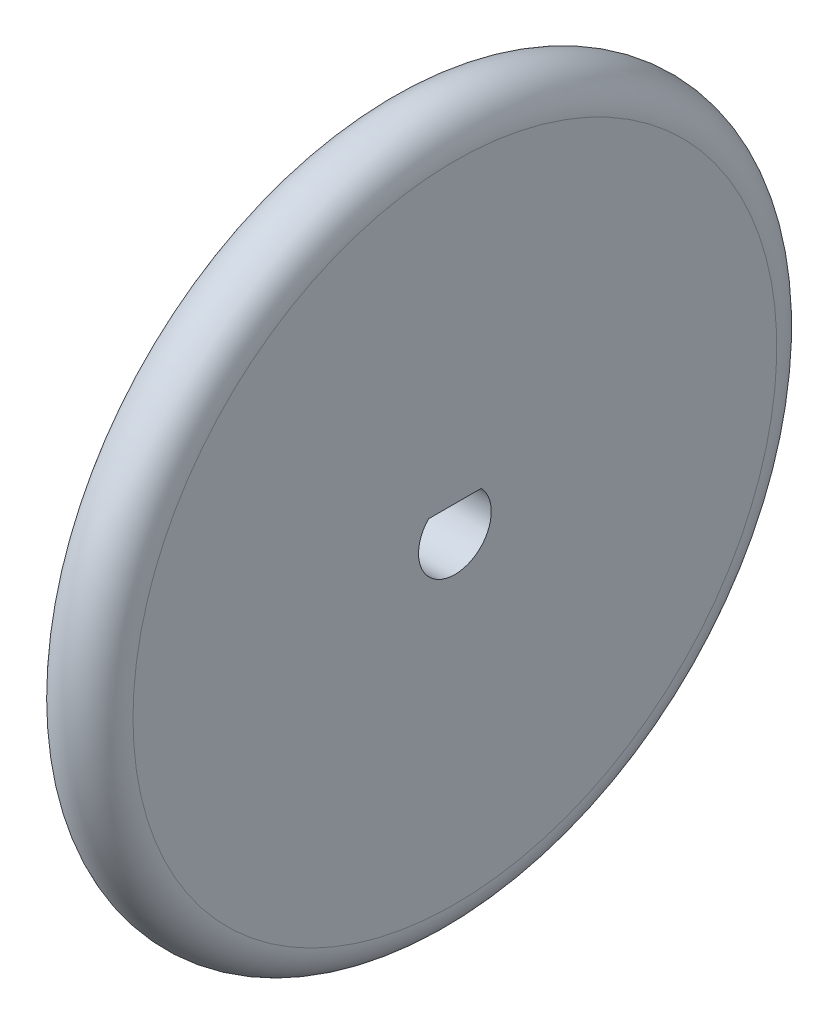
ISO-10303-21;
HEADER;
FILE_DESCRIPTION(('STEP AP214'),'2;1');
FILE_NAME('part.step','',(''),(''),'','','');
FILE_SCHEMA(('AUTOMOTIVE_DESIGN { 1 0 10303 214 1 1 1 1 }'));
ENDSEC;
DATA;
#1=APPLICATION_CONTEXT('core data for automotive mechanical design processes');
#2=APPLICATION_PROTOCOL_DEFINITION('international standard','automotive_design',2000,#1);
#3=PRODUCT_CONTEXT('',#1,'mechanical');
#4=PRODUCT('Part','Part','',(#3));
#5=PRODUCT_RELATED_PRODUCT_CATEGORY('part','',(#4));
#6=PRODUCT_DEFINITION_FORMATION('','',#4);
#7=PRODUCT_DEFINITION_CONTEXT('part definition',#1,'design');
#8=PRODUCT_DEFINITION('design','',#6,#7);
#9=PRODUCT_DEFINITION_SHAPE('','',#8);
#10=(LENGTH_UNIT() NAMED_UNIT(*) SI_UNIT(.MILLI.,.METRE.));
#11=(NAMED_UNIT(*) PLANE_ANGLE_UNIT() SI_UNIT($,.RADIAN.));
#12=(NAMED_UNIT(*) SI_UNIT($,.STERADIAN.) SOLID_ANGLE_UNIT());
#13=UNCERTAINTY_MEASURE_WITH_UNIT(LENGTH_MEASURE(1.E-05),#10,'distance_accuracy_value','');
#14=(GEOMETRIC_REPRESENTATION_CONTEXT(3) GLOBAL_UNCERTAINTY_ASSIGNED_CONTEXT((#13)) GLOBAL_UNIT_ASSIGNED_CONTEXT((#10,
#11,#12)) REPRESENTATION_CONTEXT('',''));
#15=CARTESIAN_POINT('',(0.,0.,0.));
#16=DIRECTION('',(0.,0.,1.));
#17=DIRECTION('',(1.,0.,0.));
#18=AXIS2_PLACEMENT_3D('',#15,#16,#17);
#19=CARTESIAN_POINT('',(0.,0.,0.));
#20=DIRECTION('',(-1.,0.,0.));
#21=DIRECTION('',(0.,0.,1.));
#22=AXIS2_PLACEMENT_3D('',#19,#20,#21);
#23=TOROIDAL_SURFACE('',#22,13.5,1.5);
#24=CARTESIAN_POINT('',(-1.5,0.,0.));
#25=DIRECTION('',(-1.,0.,0.));
#26=DIRECTION('',(0.,0.,1.));
#27=AXIS2_PLACEMENT_3D('',#24,#25,#26);
#28=CIRCLE('',#27,13.5);
#29=CARTESIAN_POINT('',(-1.5,0.,13.5));
#30=VERTEX_POINT('',#29);
#31=EDGE_CURVE('E47',#30,#30,#28,.T.);
#32=ORIENTED_EDGE('',*,*,#31,.F.);
#33=EDGE_LOOP('',(#32));
#34=FACE_BOUND('',#33,.T.);
#35=CARTESIAN_POINT('',(1.5,0.,0.));
#36=DIRECTION('',(-1.,0.,0.));
#37=DIRECTION('',(0.,0.,1.));
#38=AXIS2_PLACEMENT_3D('',#35,#36,#37);
#39=CIRCLE('',#38,13.5);
#40=CARTESIAN_POINT('',(1.5,0.,13.5));
#41=VERTEX_POINT('',#40);
#42=EDGE_CURVE('E93',#41,#41,#39,.T.);
#43=ORIENTED_EDGE('',*,*,#42,.T.);
#44=EDGE_LOOP('',(#43));
#45=FACE_BOUND('',#44,.T.);
#46=ADVANCED_FACE('F39',(#34,#45),#23,.T.);
#47=CARTESIAN_POINT('',(-1.5,13.5,0.));
#48=DIRECTION('',(1.,0.,0.));
#49=DIRECTION('',(0.,0.,-1.));
#50=AXIS2_PLACEMENT_3D('',#47,#48,#49);
#51=PLANE('',#50);
#52=CARTESIAN_POINT('',(-1.5,0.,0.));
#53=DIRECTION('',(1.,0.,0.));
#54=DIRECTION('',(0.,0.,-1.));
#55=AXIS2_PLACEMENT_3D('',#52,#53,#54);
#56=CIRCLE('',#55,4.);
#57=CARTESIAN_POINT('',(-1.5,0.,-4.));
#58=VERTEX_POINT('',#57);
#59=EDGE_CURVE('E11',#58,#58,#56,.F.);
#60=ORIENTED_EDGE('',*,*,#59,.F.);
#61=EDGE_LOOP('',(#60));
#62=FACE_BOUND('',#61,.T.);
#63=ORIENTED_EDGE('',*,*,#31,.T.);
#64=EDGE_LOOP('',(#63));
#65=FACE_BOUND('',#64,.T.);
#66=ADVANCED_FACE('F100',(#62,#65),#51,.F.);
#67=CARTESIAN_POINT('',(1.5,0.,0.));
#68=DIRECTION('',(-1.,0.,0.));
#69=DIRECTION('',(0.,0.,1.));
#70=AXIS2_PLACEMENT_3D('',#67,#68,#69);
#71=PLANE('',#70);
#72=DIRECTION('',(0.,0.,-1.));
#73=VECTOR('',#72,1.);
#74=CARTESIAN_POINT('',(1.5,1.05,-1.10594981802973));
#75=LINE('',#74,#73);
#76=CARTESIAN_POINT('',(1.5,1.05,1.10594981802973));
#77=VERTEX_POINT('',#76);
#78=CARTESIAN_POINT('',(1.5,1.05,-1.10594981802973));
#79=VERTEX_POINT('',#78);
#80=EDGE_CURVE('E85',#77,#79,#75,.T.);
#81=ORIENTED_EDGE('',*,*,#80,.T.);
#82=CARTESIAN_POINT('',(1.5,0.,0.));
#83=DIRECTION('',(-1.,0.,0.));
#84=DIRECTION('',(0.,0.,1.));
#85=AXIS2_PLACEMENT_3D('',#82,#83,#84);
#86=CIRCLE('',#85,1.525);
#87=EDGE_CURVE('E54',#79,#77,#86,.T.);
#88=ORIENTED_EDGE('',*,*,#87,.T.);
#89=EDGE_LOOP('',(#81,#88));
#90=FACE_BOUND('',#89,.T.);
#91=ORIENTED_EDGE('',*,*,#42,.F.);
#92=EDGE_LOOP('',(#91));
#93=FACE_BOUND('',#92,.T.);
#94=ADVANCED_FACE('F106',(#90,#93),#71,.F.);
#95=CARTESIAN_POINT('',(-4.5,0.,0.));
#96=DIRECTION('',(1.,0.,0.));
#97=DIRECTION('',(0.,0.,-1.));
#98=AXIS2_PLACEMENT_3D('',#95,#96,#97);
#99=CYLINDRICAL_SURFACE('',#98,4.);
#100=CARTESIAN_POINT('',(-4.5,0.,0.));
#101=DIRECTION('',(-1.,0.,0.));
#102=DIRECTION('',(0.,0.,1.));
#103=AXIS2_PLACEMENT_3D('',#100,#101,#102);
#104=CIRCLE('',#103,4.);
#105=CARTESIAN_POINT('',(-4.5,0.,4.));
#106=VERTEX_POINT('',#105);
#107=EDGE_CURVE('E71',#106,#106,#104,.T.);
#108=ORIENTED_EDGE('',*,*,#107,.F.);
#109=EDGE_LOOP('',(#108));
#110=FACE_BOUND('',#109,.T.);
#111=ORIENTED_EDGE('',*,*,#59,.T.);
#112=EDGE_LOOP('',(#111));
#113=FACE_BOUND('',#112,.T.);
#114=ADVANCED_FACE('F108',(#110,#113),#99,.T.);
#115=CARTESIAN_POINT('',(-4.5,0.,0.));
#116=DIRECTION('',(-1.,0.,0.));
#117=DIRECTION('',(0.,0.,1.));
#118=AXIS2_PLACEMENT_3D('',#115,#116,#117);
#119=PLANE('',#118);
#120=CARTESIAN_POINT('',(-4.5,0.,0.));
#121=DIRECTION('',(-1.,0.,0.));
#122=DIRECTION('',(0.,0.,1.));
#123=AXIS2_PLACEMENT_3D('',#120,#121,#122);
#124=CIRCLE('',#123,1.525);
#125=CARTESIAN_POINT('',(-4.5,1.05,-1.10594981802973));
#126=VERTEX_POINT('',#125);
#127=CARTESIAN_POINT('',(-4.5,1.05,1.10594981802973));
#128=VERTEX_POINT('',#127);
#129=EDGE_CURVE('E59',#126,#128,#124,.T.);
#130=ORIENTED_EDGE('',*,*,#129,.F.);
#131=DIRECTION('',(0.,0.,-1.));
#132=VECTOR('',#131,1.);
#133=CARTESIAN_POINT('',(-4.5,1.05,-1.10594981802973));
#134=LINE('',#133,#132);
#135=EDGE_CURVE('E75',#128,#126,#134,.T.);
#136=ORIENTED_EDGE('',*,*,#135,.F.);
#137=EDGE_LOOP('',(#130,#136));
#138=FACE_BOUND('',#137,.T.);
#139=ORIENTED_EDGE('',*,*,#107,.T.);
#140=EDGE_LOOP('',(#139));
#141=FACE_BOUND('',#140,.T.);
#142=ADVANCED_FACE('F80',(#138,#141),#119,.T.);
#143=CARTESIAN_POINT('',(1.5,0.,0.));
#144=DIRECTION('',(-1.,0.,0.));
#145=DIRECTION('',(0.,0.,1.));
#146=AXIS2_PLACEMENT_3D('',#143,#144,#145);
#147=CYLINDRICAL_SURFACE('',#146,1.525);
#148=ORIENTED_EDGE('',*,*,#129,.T.);
#149=DIRECTION('',(-1.,0.,0.));
#150=VECTOR('',#149,1.);
#151=CARTESIAN_POINT('',(1.5,1.05,1.10594981802973));
#152=LINE('',#151,#150);
#153=EDGE_CURVE('E72',#77,#128,#152,.T.);
#154=ORIENTED_EDGE('',*,*,#153,.F.);
#155=ORIENTED_EDGE('',*,*,#87,.F.);
#156=DIRECTION('',(-1.,0.,0.));
#157=VECTOR('',#156,1.);
#158=CARTESIAN_POINT('',(1.5,1.05,-1.10594981802973));
#159=LINE('',#158,#157);
#160=EDGE_CURVE('E64',#79,#126,#159,.T.);
#161=ORIENTED_EDGE('',*,*,#160,.T.);
#162=EDGE_LOOP('',(#148,#154,#155,#161));
#163=FACE_BOUND('',#162,.T.);
#164=ADVANCED_FACE('F66',(#163),#147,.F.);
#165=CARTESIAN_POINT('',(1.5,1.05,-1.10594981802973));
#166=DIRECTION('',(0.,1.,0.));
#167=DIRECTION('',(0.,0.,1.));
#168=AXIS2_PLACEMENT_3D('',#165,#166,#167);
#169=PLANE('',#168);
#170=ORIENTED_EDGE('',*,*,#135,.T.);
#171=ORIENTED_EDGE('',*,*,#160,.F.);
#172=ORIENTED_EDGE('',*,*,#80,.F.);
#173=ORIENTED_EDGE('',*,*,#153,.T.);
#174=EDGE_LOOP('',(#170,#171,#172,#173));
#175=FACE_BOUND('',#174,.T.);
#176=ADVANCED_FACE('F76',(#175),#169,.F.);
#177=CLOSED_SHELL('',(#46,#66,#94,#114,#142,#164,#176));
#178=MANIFOLD_SOLID_BREP('B2',#177);
#179=ADVANCED_BREP_SHAPE_REPRESENTATION('',(#18,#178),#14);
#180=SHAPE_DEFINITION_REPRESENTATION(#9,#179);
ENDSEC;
END-ISO-10303-21;
